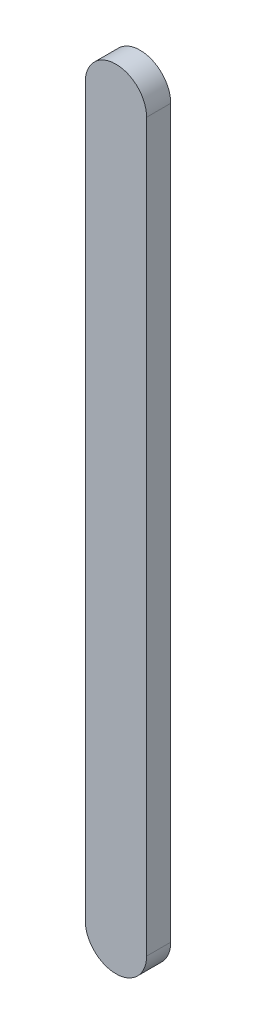
ISO-10303-21;
HEADER;
FILE_DESCRIPTION(('STEP AP214'),'2;1');
FILE_NAME('part.step','',(''),(''),'','','');
FILE_SCHEMA(('AUTOMOTIVE_DESIGN { 1 0 10303 214 1 1 1 1 }'));
ENDSEC;
DATA;
#1=APPLICATION_CONTEXT('core data for automotive mechanical design processes');
#2=APPLICATION_PROTOCOL_DEFINITION('international standard','automotive_design',2000,#1);
#3=PRODUCT_CONTEXT('',#1,'mechanical');
#4=PRODUCT('Part','Part','',(#3));
#5=PRODUCT_RELATED_PRODUCT_CATEGORY('part','',(#4));
#6=PRODUCT_DEFINITION_FORMATION('','',#4);
#7=PRODUCT_DEFINITION_CONTEXT('part definition',#1,'design');
#8=PRODUCT_DEFINITION('design','',#6,#7);
#9=PRODUCT_DEFINITION_SHAPE('','',#8);
#10=(LENGTH_UNIT() NAMED_UNIT(*) SI_UNIT(.MILLI.,.METRE.));
#11=(NAMED_UNIT(*) PLANE_ANGLE_UNIT() SI_UNIT($,.RADIAN.));
#12=(NAMED_UNIT(*) SI_UNIT($,.STERADIAN.) SOLID_ANGLE_UNIT());
#13=UNCERTAINTY_MEASURE_WITH_UNIT(LENGTH_MEASURE(1.E-05),#10,'distance_accuracy_value','');
#14=(GEOMETRIC_REPRESENTATION_CONTEXT(3) GLOBAL_UNCERTAINTY_ASSIGNED_CONTEXT((#13)) GLOBAL_UNIT_ASSIGNED_CONTEXT((#10,
#11,#12)) REPRESENTATION_CONTEXT('',''));
#15=CARTESIAN_POINT('',(0.,0.,0.));
#16=DIRECTION('',(0.,0.,1.));
#17=DIRECTION('',(1.,0.,0.));
#18=AXIS2_PLACEMENT_3D('',#15,#16,#17);
#19=CARTESIAN_POINT('',(146.685,59.5122,0.));
#20=DIRECTION('',(-1.,0.,0.));
#21=DIRECTION('',(0.,1.,0.));
#22=AXIS2_PLACEMENT_3D('',#19,#20,#21);
#23=PLANE('',#22);
#24=DIRECTION('',(0.,1.,0.));
#25=VECTOR('',#24,1.);
#26=CARTESIAN_POINT('',(146.685,59.5122,0.1999996));
#27=LINE('',#26,#25);
#28=CARTESIAN_POINT('',(146.685,59.5122,0.1999996));
#29=VERTEX_POINT('',#28);
#30=CARTESIAN_POINT('',(146.685,65.5290028,0.1999996));
#31=VERTEX_POINT('',#30);
#32=EDGE_CURVE('E11',#29,#31,#27,.T.);
#33=ORIENTED_EDGE('',*,*,#32,.F.);
#34=DIRECTION('',(0.,0.,1.));
#35=VECTOR('',#34,1.);
#36=CARTESIAN_POINT('',(146.685,59.5122,0.));
#37=LINE('',#36,#35);
#38=CARTESIAN_POINT('',(146.685,59.5122,0.));
#39=VERTEX_POINT('',#38);
#40=EDGE_CURVE('E24',#39,#29,#37,.T.);
#41=ORIENTED_EDGE('',*,*,#40,.F.);
#42=DIRECTION('',(0.,1.,0.));
#43=VECTOR('',#42,1.);
#44=CARTESIAN_POINT('',(146.685,59.5122,0.));
#45=LINE('',#44,#43);
#46=CARTESIAN_POINT('',(146.685,65.5290028,0.));
#47=VERTEX_POINT('',#46);
#48=EDGE_CURVE('E75',#39,#47,#45,.T.);
#49=ORIENTED_EDGE('',*,*,#48,.T.);
#50=DIRECTION('',(0.,0.,1.));
#51=VECTOR('',#50,1.);
#52=CARTESIAN_POINT('',(146.685,65.5290028,0.));
#53=LINE('',#52,#51);
#54=EDGE_CURVE('E37',#47,#31,#53,.T.);
#55=ORIENTED_EDGE('',*,*,#54,.T.);
#56=EDGE_LOOP('',(#33,#41,#49,#55));
#57=FACE_BOUND('',#56,.T.);
#58=ADVANCED_FACE('F17',(#57),#23,.F.);
#59=CARTESIAN_POINT('',(146.431,65.5290028,0.));
#60=DIRECTION('',(0.,0.,-1.));
#61=DIRECTION('',(1.,0.,0.));
#62=AXIS2_PLACEMENT_3D('',#59,#60,#61);
#63=CYLINDRICAL_SURFACE('',#62,0.254000000000005);
#64=CARTESIAN_POINT('',(146.431,65.5290028,0.1999996));
#65=DIRECTION('',(0.,0.,1.));
#66=DIRECTION('',(1.,0.,0.));
#67=AXIS2_PLACEMENT_3D('',#64,#65,#66);
#68=CIRCLE('',#67,0.254000000000005);
#69=CARTESIAN_POINT('',(146.177,65.5290028,0.1999996));
#70=VERTEX_POINT('',#69);
#71=EDGE_CURVE('E83',#31,#70,#68,.T.);
#72=ORIENTED_EDGE('',*,*,#71,.F.);
#73=ORIENTED_EDGE('',*,*,#54,.F.);
#74=CARTESIAN_POINT('',(146.431,65.5290028,0.));
#75=DIRECTION('',(0.,0.,1.));
#76=DIRECTION('',(1.,0.,0.));
#77=AXIS2_PLACEMENT_3D('',#74,#75,#76);
#78=CIRCLE('',#77,0.254000000000005);
#79=CARTESIAN_POINT('',(146.177,65.5290028,0.));
#80=VERTEX_POINT('',#79);
#81=EDGE_CURVE('E81',#47,#80,#78,.T.);
#82=ORIENTED_EDGE('',*,*,#81,.T.);
#83=DIRECTION('',(0.,0.,1.));
#84=VECTOR('',#83,1.);
#85=CARTESIAN_POINT('',(146.177,65.5290028,0.));
#86=LINE('',#85,#84);
#87=EDGE_CURVE('E67',#80,#70,#86,.T.);
#88=ORIENTED_EDGE('',*,*,#87,.T.);
#89=EDGE_LOOP('',(#72,#73,#82,#88));
#90=FACE_BOUND('',#89,.T.);
#91=ADVANCED_FACE('F89',(#90),#63,.T.);
#92=CARTESIAN_POINT('',(146.177,65.5290028,0.));
#93=DIRECTION('',(1.,0.,0.));
#94=DIRECTION('',(0.,-1.,0.));
#95=AXIS2_PLACEMENT_3D('',#92,#93,#94);
#96=PLANE('',#95);
#97=DIRECTION('',(0.,-1.,0.));
#98=VECTOR('',#97,1.);
#99=CARTESIAN_POINT('',(146.177,65.5290028,0.1999996));
#100=LINE('',#99,#98);
#101=CARTESIAN_POINT('',(146.177,59.5122,0.1999996));
#102=VERTEX_POINT('',#101);
#103=EDGE_CURVE('E71',#70,#102,#100,.T.);
#104=ORIENTED_EDGE('',*,*,#103,.F.);
#105=ORIENTED_EDGE('',*,*,#87,.F.);
#106=DIRECTION('',(0.,-1.,0.));
#107=VECTOR('',#106,1.);
#108=CARTESIAN_POINT('',(146.177,65.5290028,0.));
#109=LINE('',#108,#107);
#110=CARTESIAN_POINT('',(146.177,59.5122,0.));
#111=VERTEX_POINT('',#110);
#112=EDGE_CURVE('E63',#80,#111,#109,.T.);
#113=ORIENTED_EDGE('',*,*,#112,.T.);
#114=DIRECTION('',(0.,0.,1.));
#115=VECTOR('',#114,1.);
#116=CARTESIAN_POINT('',(146.177,59.5122,0.));
#117=LINE('',#116,#115);
#118=EDGE_CURVE('E53',#111,#102,#117,.T.);
#119=ORIENTED_EDGE('',*,*,#118,.T.);
#120=EDGE_LOOP('',(#104,#105,#113,#119));
#121=FACE_BOUND('',#120,.T.);
#122=ADVANCED_FACE('F66',(#121),#96,.F.);
#123=CARTESIAN_POINT('',(146.431,59.5122,0.));
#124=DIRECTION('',(0.,0.,-1.));
#125=DIRECTION('',(-1.,0.,0.));
#126=AXIS2_PLACEMENT_3D('',#123,#124,#125);
#127=CYLINDRICAL_SURFACE('',#126,0.254);
#128=CARTESIAN_POINT('',(146.431,59.5122,0.1999996));
#129=DIRECTION('',(0.,0.,1.));
#130=DIRECTION('',(-1.,0.,0.));
#131=AXIS2_PLACEMENT_3D('',#128,#129,#130);
#132=CIRCLE('',#131,0.254);
#133=EDGE_CURVE('E59',#102,#29,#132,.T.);
#134=ORIENTED_EDGE('',*,*,#133,.F.);
#135=ORIENTED_EDGE('',*,*,#118,.F.);
#136=CARTESIAN_POINT('',(146.431,59.5122,0.));
#137=DIRECTION('',(0.,0.,1.));
#138=DIRECTION('',(-1.,0.,0.));
#139=AXIS2_PLACEMENT_3D('',#136,#137,#138);
#140=CIRCLE('',#139,0.254);
#141=EDGE_CURVE('E57',#111,#39,#140,.T.);
#142=ORIENTED_EDGE('',*,*,#141,.T.);
#143=ORIENTED_EDGE('',*,*,#40,.T.);
#144=EDGE_LOOP('',(#134,#135,#142,#143));
#145=FACE_BOUND('',#144,.T.);
#146=ADVANCED_FACE('F55',(#145),#127,.T.);
#147=CARTESIAN_POINT('',(146.685,59.5122,0.));
#148=DIRECTION('',(0.,0.,-1.));
#149=DIRECTION('',(-1.,0.,0.));
#150=AXIS2_PLACEMENT_3D('',#147,#148,#149);
#151=PLANE('',#150);
#152=ORIENTED_EDGE('',*,*,#141,.F.);
#153=ORIENTED_EDGE('',*,*,#112,.F.);
#154=ORIENTED_EDGE('',*,*,#81,.F.);
#155=ORIENTED_EDGE('',*,*,#48,.F.);
#156=EDGE_LOOP('',(#152,#153,#154,#155));
#157=FACE_BOUND('',#156,.T.);
#158=ADVANCED_FACE('F74',(#157),#151,.T.);
#159=CARTESIAN_POINT('',(146.685,59.5122,0.1999996));
#160=DIRECTION('',(0.,0.,-1.));
#161=DIRECTION('',(-1.,0.,0.));
#162=AXIS2_PLACEMENT_3D('',#159,#160,#161);
#163=PLANE('',#162);
#164=ORIENTED_EDGE('',*,*,#32,.T.);
#165=ORIENTED_EDGE('',*,*,#71,.T.);
#166=ORIENTED_EDGE('',*,*,#103,.T.);
#167=ORIENTED_EDGE('',*,*,#133,.T.);
#168=EDGE_LOOP('',(#164,#165,#166,#167));
#169=FACE_BOUND('',#168,.T.);
#170=ADVANCED_FACE('F91',(#169),#163,.F.);
#171=CLOSED_SHELL('',(#58,#91,#122,#146,#158,#170));
#172=MANIFOLD_SOLID_BREP('B1',#171);
#173=ADVANCED_BREP_SHAPE_REPRESENTATION('',(#18,#172),#14);
#174=SHAPE_DEFINITION_REPRESENTATION(#9,#173);
ENDSEC;
END-ISO-10303-21;
